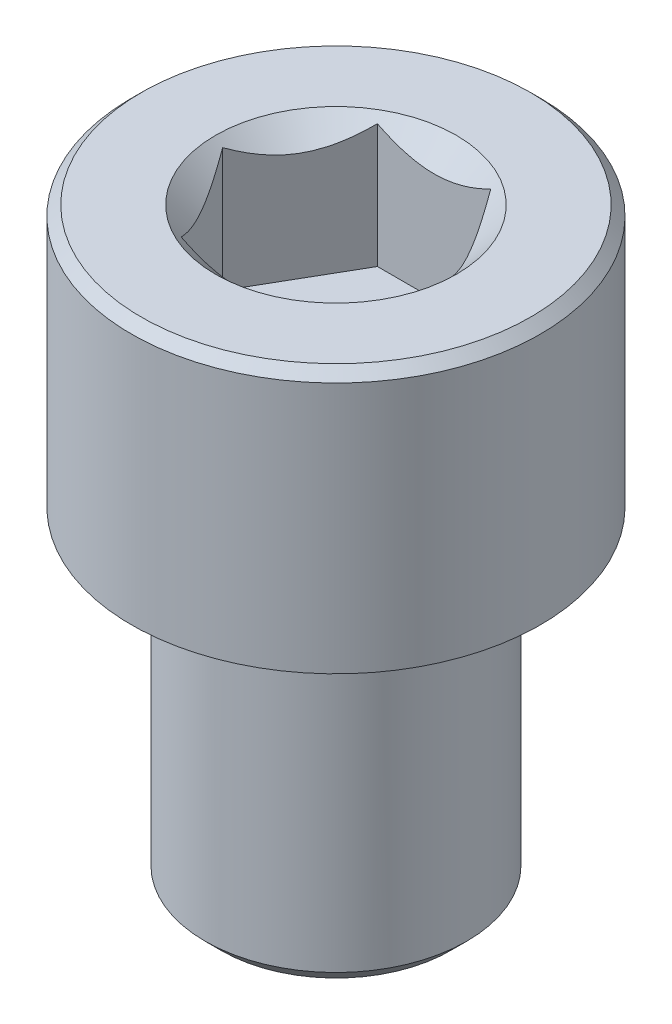
ISO-10303-21;
HEADER;
FILE_DESCRIPTION(('STEP AP214'),'2;1');
FILE_NAME('part.step','',(''),(''),'','','');
FILE_SCHEMA(('AUTOMOTIVE_DESIGN { 1 0 10303 214 1 1 1 1 }'));
ENDSEC;
DATA;
#1=APPLICATION_CONTEXT('core data for automotive mechanical design processes');
#2=APPLICATION_PROTOCOL_DEFINITION('international standard','automotive_design',2000,#1);
#3=PRODUCT_CONTEXT('',#1,'mechanical');
#4=PRODUCT('Part','Part','',(#3));
#5=PRODUCT_RELATED_PRODUCT_CATEGORY('part','',(#4));
#6=PRODUCT_DEFINITION_FORMATION('','',#4);
#7=PRODUCT_DEFINITION_CONTEXT('part definition',#1,'design');
#8=PRODUCT_DEFINITION('design','',#6,#7);
#9=PRODUCT_DEFINITION_SHAPE('','',#8);
#10=(LENGTH_UNIT() NAMED_UNIT(*) SI_UNIT(.MILLI.,.METRE.));
#11=(NAMED_UNIT(*) PLANE_ANGLE_UNIT() SI_UNIT($,.RADIAN.));
#12=(NAMED_UNIT(*) SI_UNIT($,.STERADIAN.) SOLID_ANGLE_UNIT());
#13=UNCERTAINTY_MEASURE_WITH_UNIT(LENGTH_MEASURE(1.E-05),#10,'distance_accuracy_value','');
#14=(GEOMETRIC_REPRESENTATION_CONTEXT(3) GLOBAL_UNCERTAINTY_ASSIGNED_CONTEXT((#13)) GLOBAL_UNIT_ASSIGNED_CONTEXT((#10,
#11,#12)) REPRESENTATION_CONTEXT('',''));
#15=CARTESIAN_POINT('',(0.,0.,0.));
#16=DIRECTION('',(0.,0.,1.));
#17=DIRECTION('',(1.,0.,0.));
#18=AXIS2_PLACEMENT_3D('',#15,#16,#17);
#19=CARTESIAN_POINT('',(0.,0.,0.));
#20=DIRECTION('',(0.,1.,0.));
#21=DIRECTION('',(0.,0.,1.));
#22=AXIS2_PLACEMENT_3D('',#19,#20,#21);
#23=PLANE('',#22);
#24=CARTESIAN_POINT('',(0.,0.,0.));
#25=DIRECTION('',(0.,1.,0.));
#26=DIRECTION('',(0.,0.,1.));
#27=AXIS2_PLACEMENT_3D('',#24,#25,#26);
#28=CIRCLE('',#27,3.5);
#29=CARTESIAN_POINT('',(0.,0.,3.5));
#30=VERTEX_POINT('',#29);
#31=EDGE_CURVE('E42',#30,#30,#28,.F.);
#32=ORIENTED_EDGE('',*,*,#31,.T.);
#33=EDGE_LOOP('',(#32));
#34=FACE_BOUND('',#33,.T.);
#35=ADVANCED_FACE('F34',(#34),#23,.F.);
#36=CARTESIAN_POINT('',(0.,0.,0.));
#37=DIRECTION('',(0.,-1.,0.));
#38=DIRECTION('',(0.,0.,-1.));
#39=AXIS2_PLACEMENT_3D('',#36,#37,#38);
#40=CYLINDRICAL_SURFACE('',#39,4.);
#41=CARTESIAN_POINT('',(0.,0.500000000000004,0.));
#42=DIRECTION('',(0.,1.,0.));
#43=DIRECTION('',(0.,0.,1.));
#44=AXIS2_PLACEMENT_3D('',#41,#42,#43);
#45=CIRCLE('',#44,4.);
#46=CARTESIAN_POINT('',(0.,0.500000000000004,4.));
#47=VERTEX_POINT('',#46);
#48=EDGE_CURVE('E11',#47,#47,#45,.T.);
#49=ORIENTED_EDGE('',*,*,#48,.T.);
#50=EDGE_LOOP('',(#49));
#51=FACE_BOUND('',#50,.T.);
#52=CARTESIAN_POINT('',(0.,10.,0.));
#53=DIRECTION('',(0.,-1.,0.));
#54=DIRECTION('',(0.,0.,-1.));
#55=AXIS2_PLACEMENT_3D('',#52,#53,#54);
#56=CIRCLE('',#55,4.);
#57=CARTESIAN_POINT('',(0.,10.,-4.));
#58=VERTEX_POINT('',#57);
#59=EDGE_CURVE('E119',#58,#58,#56,.T.);
#60=ORIENTED_EDGE('',*,*,#59,.T.);
#61=EDGE_LOOP('',(#60));
#62=FACE_BOUND('',#61,.T.);
#63=ADVANCED_FACE('F190',(#51,#62),#40,.T.);
#64=CARTESIAN_POINT('',(-4.,10.,0.));
#65=DIRECTION('',(0.,1.,0.));
#66=DIRECTION('',(0.,0.,1.));
#67=AXIS2_PLACEMENT_3D('',#64,#65,#66);
#68=PLANE('',#67);
#69=ORIENTED_EDGE('',*,*,#59,.F.);
#70=EDGE_LOOP('',(#69));
#71=FACE_BOUND('',#70,.T.);
#72=CARTESIAN_POINT('',(0.,10.,0.));
#73=DIRECTION('',(0.,-1.,0.));
#74=DIRECTION('',(0.,0.,-1.));
#75=AXIS2_PLACEMENT_3D('',#72,#73,#74);
#76=CIRCLE('',#75,6.25);
#77=CARTESIAN_POINT('',(0.,10.,-6.25));
#78=VERTEX_POINT('',#77);
#79=EDGE_CURVE('E116',#78,#78,#76,.T.);
#80=ORIENTED_EDGE('',*,*,#79,.T.);
#81=EDGE_LOOP('',(#80));
#82=FACE_BOUND('',#81,.T.);
#83=ADVANCED_FACE('F196',(#71,#82),#68,.F.);
#84=CARTESIAN_POINT('',(0.,0.,0.));
#85=DIRECTION('',(0.,-1.,0.));
#86=DIRECTION('',(0.,0.,-1.));
#87=AXIS2_PLACEMENT_3D('',#84,#85,#86);
#88=CYLINDRICAL_SURFACE('',#87,6.25);
#89=CARTESIAN_POINT('',(0.,17.7,0.));
#90=DIRECTION('',(0.,-1.,0.));
#91=DIRECTION('',(0.,0.,-1.));
#92=AXIS2_PLACEMENT_3D('',#89,#90,#91);
#93=CIRCLE('',#92,6.25);
#94=CARTESIAN_POINT('',(0.,17.7,-6.25));
#95=VERTEX_POINT('',#94);
#96=EDGE_CURVE('E122',#95,#95,#93,.T.);
#97=ORIENTED_EDGE('',*,*,#96,.T.);
#98=EDGE_LOOP('',(#97));
#99=FACE_BOUND('',#98,.T.);
#100=ORIENTED_EDGE('',*,*,#79,.F.);
#101=EDGE_LOOP('',(#100));
#102=FACE_BOUND('',#101,.T.);
#103=ADVANCED_FACE('F207',(#99,#102),#88,.T.);
#104=CARTESIAN_POINT('',(-6.25,18.,0.));
#105=DIRECTION('',(0.,-1.,0.));
#106=DIRECTION('',(0.,0.,-1.));
#107=AXIS2_PLACEMENT_3D('',#104,#105,#106);
#108=PLANE('',#107);
#109=CARTESIAN_POINT('',(0.,18.,0.));
#110=DIRECTION('',(0.,1.,0.));
#111=DIRECTION('',(0.,0.,1.));
#112=AXIS2_PLACEMENT_3D('',#109,#110,#111);
#113=CIRCLE('',#112,3.68172134015619);
#114=CARTESIAN_POINT('',(0.,18.,3.68172134015619));
#115=VERTEX_POINT('',#114);
#116=EDGE_CURVE('E337',#115,#115,#113,.T.);
#117=ORIENTED_EDGE('',*,*,#116,.F.);
#118=EDGE_LOOP('',(#117));
#119=FACE_BOUND('',#118,.T.);
#120=CARTESIAN_POINT('',(0.,18.,0.));
#121=DIRECTION('',(0.,-1.,0.));
#122=DIRECTION('',(0.,0.,-1.));
#123=AXIS2_PLACEMENT_3D('',#120,#121,#122);
#124=CIRCLE('',#123,5.95);
#125=CARTESIAN_POINT('',(0.,18.,-5.95));
#126=VERTEX_POINT('',#125);
#127=EDGE_CURVE('E93',#126,#126,#124,.F.);
#128=ORIENTED_EDGE('',*,*,#127,.T.);
#129=EDGE_LOOP('',(#128));
#130=FACE_BOUND('',#129,.T.);
#131=ADVANCED_FACE('F202',(#119,#130),#108,.F.);
#132=CARTESIAN_POINT('',(0.,17.7,0.));
#133=DIRECTION('',(0.,-1.,0.));
#134=DIRECTION('',(0.,0.,-1.));
#135=AXIS2_PLACEMENT_3D('',#132,#133,#134);
#136=CONICAL_SURFACE('',#135,6.25,0.785398163397451);
#137=ORIENTED_EDGE('',*,*,#127,.F.);
#138=EDGE_LOOP('',(#137));
#139=FACE_BOUND('',#138,.T.);
#140=ORIENTED_EDGE('',*,*,#96,.F.);
#141=EDGE_LOOP('',(#140));
#142=FACE_BOUND('',#141,.T.);
#143=ADVANCED_FACE('F138',(#139,#142),#136,.T.);
#144=CARTESIAN_POINT('',(0.,18.,0.));
#145=DIRECTION('',(0.,1.,0.));
#146=DIRECTION('',(0.,0.,1.));
#147=AXIS2_PLACEMENT_3D('',#144,#145,#146);
#148=CONICAL_SURFACE('',#147,3.68172134015619,0.785398163397449);
#149=ORIENTED_EDGE('',*,*,#116,.T.);
#150=EDGE_LOOP('',(#149));
#151=FACE_BOUND('',#150,.T.);
#152=CARTESIAN_POINT('',(-3.57414153717217,18.9845928078346,3.));
#153=CARTESIAN_POINT('',(-3.48763354421076,18.918347344031,3.));
#154=CARTESIAN_POINT('',(-3.4006548570127,18.8527068014046,3.));
#155=CARTESIAN_POINT('',(-3.22556536628367,18.7229105596247,3.));
#156=CARTESIAN_POINT('',(-3.13745429592207,18.6587552207989,3.));
#157=CARTESIAN_POINT('',(-2.95926502940819,18.5317477625692,3.));
#158=CARTESIAN_POINT('',(-2.86917689491203,18.4689095404859,3.));
#159=CARTESIAN_POINT('',(-2.68749351951163,18.3454583721269,3.));
#160=CARTESIAN_POINT('',(-2.5958983836401,18.2848452717117,3.));
#161=CARTESIAN_POINT('',(-2.40523426187287,18.1626856152111,3.));
#162=CARTESIAN_POINT('',(-2.30605328102178,18.1013129786067,3.));
#163=CARTESIAN_POINT('',(-2.10536506104801,17.9824325210317,3.));
#164=CARTESIAN_POINT('',(-2.00385743987678,17.9249253409785,3.));
#165=CARTESIAN_POINT('',(-1.79849745550954,17.8150046063731,3.));
#166=CARTESIAN_POINT('',(-1.69465316441121,17.7625760890662,3.));
#167=CARTESIAN_POINT('',(-1.48405420683511,17.663987161909,3.));
#168=CARTESIAN_POINT('',(-1.37730092797841,17.6178238242345,3.));
#169=CARTESIAN_POINT('',(-1.17088222190216,17.5374103113695,3.));
#170=CARTESIAN_POINT('',(-1.07149734601239,17.5024473221765,3.));
#171=CARTESIAN_POINT('',(-0.870230144552072,17.4404802404136,3.));
#172=CARTESIAN_POINT('',(-0.768347657354243,17.4134766643998,3.));
#173=CARTESIAN_POINT('',(-0.564447624779059,17.3693266023403,3.));
#174=CARTESIAN_POINT('',(-0.462468933304162,17.3520036676269,3.));
#175=CARTESIAN_POINT('',(-0.257288650084502,17.3275703633682,3.));
#176=CARTESIAN_POINT('',(-0.154087304614487,17.3204579712627,3.));
#177=CARTESIAN_POINT('',(0.0481861337271417,17.3170323431805,3.));
#178=CARTESIAN_POINT('',(0.147250905244535,17.3202810238262,3.));
#179=CARTESIAN_POINT('',(0.344589076655322,17.3364014246806,3.));
#180=CARTESIAN_POINT('',(0.442862402476966,17.3492740352571,3.));
#181=CARTESIAN_POINT('',(0.639570667541513,17.3841396910622,3.));
#182=CARTESIAN_POINT('',(0.737976852204938,17.4062922789742,3.));
#183=CARTESIAN_POINT('',(0.932628435913933,17.4585009084323,3.));
#184=CARTESIAN_POINT('',(1.02887397223985,17.4885564463,3.));
#185=CARTESIAN_POINT('',(1.22532003458176,17.5574747225556,3.));
#186=CARTESIAN_POINT('',(1.32536043310458,17.5967888675383,3.));
#187=CARTESIAN_POINT('',(1.5228495241282,17.6814775662887,3.));
#188=CARTESIAN_POINT('',(1.62029736425405,17.7268540844093,3.));
#189=CARTESIAN_POINT('',(1.8130860429893,17.8225985437204,3.));
#190=CARTESIAN_POINT('',(1.90841896877327,17.8729822890255,3.));
#191=CARTESIAN_POINT('',(2.09689622819786,17.9776272778976,3.));
#192=CARTESIAN_POINT('',(2.19004094502824,18.031887835746,3.));
#193=CARTESIAN_POINT('',(2.36987261179099,18.1407691556288,3.));
#194=CARTESIAN_POINT('',(2.45665114613525,18.1952394529636,3.));
#195=CARTESIAN_POINT('',(2.62871750489488,18.3064926464856,3.));
#196=CARTESIAN_POINT('',(2.71400521657293,18.3632757164947,3.));
#197=CARTESIAN_POINT('',(2.88259790064295,18.4782780272199,3.));
#198=CARTESIAN_POINT('',(2.96591330750259,18.5364820260229,3.));
#199=CARTESIAN_POINT('',(3.13140205426232,18.6544457904063,3.));
#200=CARTESIAN_POINT('',(3.21357570254096,18.7142051228644,3.));
#201=CARTESIAN_POINT('',(3.29527058173679,18.7746009335197,3.));
#202=B_SPLINE_CURVE_WITH_KNOTS('',3,(#152,#153,#154,#155,#156,#157,#158,#159,#160,#161,#162,
#163,#164,#165,#166,#167,#168,#169,#170,#171,#172,#173,#174,#175,#176,#177,#178,#179,#180,#181,
#182,#183,#184,#185,#186,#187,#188,#189,#190,#191,#192,#193,#194,#195,#196,#197,#198,#199,#200,
#201),.UNSPECIFIED.,.F.,.F.,(4,2,2,2,2,2,2,2,2,2,2,2,2,2,2,2,2,2,2,2,2,2,2,2,4),(0.,
0.326883534696339,0.653845561216814,0.98333357467949,1.31279872045119,1.66263039077581,
2.01251992306798,2.36134508374107,2.71000666706381,3.02579926641578,3.34161235580211,
3.65146388205707,3.96125402275306,4.25812208285704,4.555017611415,4.85724167639795,
5.15944648441815,5.48166266665301,5.80398350895795,6.12735610013866,6.45067163510514,
6.75800096012908,7.06535342598929,7.37023156667127,7.67502569596998),.UNSPECIFIED.);
#203=CARTESIAN_POINT('',(-1.73205080756888,17.7823802749816,3.));
#204=VERTEX_POINT('',#203);
#205=CARTESIAN_POINT('',(1.73205080756888,17.7823802749816,3.));
#206=VERTEX_POINT('',#205);
#207=EDGE_CURVE('E100',#204,#206,#202,.T.);
#208=ORIENTED_EDGE('',*,*,#207,.F.);
#209=CARTESIAN_POINT('',(-3.46421708519159,17.7824957508087,-0.00020000000000073));
#210=CARTESIAN_POINT('',(-3.40467869607211,17.7230085933034,0.102923514955748));
#211=CARTESIAN_POINT('',(-3.3441447475778,17.6670152544471,0.20777138933065));
#212=CARTESIAN_POINT('',(-3.2207094063533,17.5644928713605,0.421567671781096));
#213=CARTESIAN_POINT('',(-3.15779627521275,17.5180208687229,0.530536411379759));
#214=CARTESIAN_POINT('',(-3.03093496880242,17.4384134634979,0.750266639597027));
#215=CARTESIAN_POINT('',(-2.96701910000607,17.4050779756242,0.86097217176221));
#216=CARTESIAN_POINT('',(-2.83778025907547,17.3537178189609,1.08482041056532));
#217=CARTESIAN_POINT('',(-2.7724612348602,17.3356548125172,1.19795627920699));
#218=CARTESIAN_POINT('',(-2.65988677911464,17.3193571834321,1.3929409561927));
#219=CARTESIAN_POINT('',(-2.6127767304643,17.3169446421554,1.47453795400213));
#220=CARTESIAN_POINT('',(-2.51863325954798,17.3210097096387,1.63759922883009));
#221=CARTESIAN_POINT('',(-2.47159986993094,17.3274904350099,1.71906344929899));
#222=CARTESIAN_POINT('',(-2.37797867687426,17.3489719974968,1.88122011233837));
#223=CARTESIAN_POINT('',(-2.33139143122689,17.3639823649488,1.9619115887843));
#224=CARTESIAN_POINT('',(-2.23901705721439,17.4017039210476,2.12190869789133));
#225=CARTESIAN_POINT('',(-2.19322986779049,17.4244145193044,2.20121443630929));
#226=CARTESIAN_POINT('',(-2.11194373930153,17.4711409598355,2.34200614080275));
#227=CARTESIAN_POINT('',(-2.07626488907772,17.4939286026624,2.40380372214602));
#228=CARTESIAN_POINT('',(-2.00554773988155,17.543176561039,2.52628941752022));
#229=CARTESIAN_POINT('',(-1.97050946049034,17.5696369886478,2.5869774976356));
#230=CARTESIAN_POINT('',(-1.90118383838356,17.6256372693729,2.70705299739086));
#231=CARTESIAN_POINT('',(-1.86689452386373,17.6551674394599,2.76644383229592));
#232=CARTESIAN_POINT('',(-1.79895094584795,17.7169193665571,2.88412556146727));
#233=CARTESIAN_POINT('',(-1.76529630793217,17.7491394716409,2.94241710424774));
#234=CARTESIAN_POINT('',(-1.73193533751504,17.7824957508087,3.0002));
#235=B_SPLINE_CURVE_WITH_KNOTS('',3,(#209,#210,#211,#212,#213,#214,#215,#216,#217,#218,#219,
#220,#221,#222,#223,#224,#225,#226,#227,#228,#229,#230,#231,#232,#233,#234),.UNSPECIFIED.,.F.,
.F.,(4,2,2,2,2,2,2,2,2,2,2,2,4),(0.,0.399603557139307,0.801535286397844,1.19708369162343,
1.59163620080173,1.87398941755844,2.15644160919093,2.43921001247425,2.72195674032138,
2.94657516661926,3.17120044767274,3.3951375283781,3.61893808380739),.UNSPECIFIED.);
#236=CARTESIAN_POINT('',(-3.46410161513776,17.7823802749816,0.));
#237=VERTEX_POINT('',#236);
#238=EDGE_CURVE('E158',#237,#204,#235,.T.);
#239=ORIENTED_EDGE('',*,*,#238,.F.);
#240=CARTESIAN_POINT('',(-1.73193533751504,17.7824957508087,-3.0002));
#241=CARTESIAN_POINT('',(-1.79147372663452,17.7230085933034,-2.89707648504425));
#242=CARTESIAN_POINT('',(-1.85200767512883,17.6670152544471,-2.79222861066935));
#243=CARTESIAN_POINT('',(-1.97544301635334,17.5644928713605,-2.5784323282189));
#244=CARTESIAN_POINT('',(-2.03835614749388,17.5180208687229,-2.46946358862024));
#245=CARTESIAN_POINT('',(-2.16521745390422,17.4384134634979,-2.24973336040297));
#246=CARTESIAN_POINT('',(-2.22913332270057,17.4050779756242,-2.13902782823779));
#247=CARTESIAN_POINT('',(-2.35837216363117,17.3537178189609,-1.91517958943468));
#248=CARTESIAN_POINT('',(-2.42369118784644,17.3356548125172,-1.80204372079301));
#249=CARTESIAN_POINT('',(-2.53626564359199,17.3193571834321,-1.6070590438073));
#250=CARTESIAN_POINT('',(-2.58337569224233,17.3169446421554,-1.52546204599787));
#251=CARTESIAN_POINT('',(-2.67751916315865,17.3210097096387,-1.36240077116991));
#252=CARTESIAN_POINT('',(-2.72455255277569,17.3274904350099,-1.28093655070101));
#253=CARTESIAN_POINT('',(-2.81817374583237,17.3489719974968,-1.11877988766163));
#254=CARTESIAN_POINT('',(-2.86476099147974,17.3639823649488,-1.0380884112157));
#255=CARTESIAN_POINT('',(-2.95713536549225,17.4017039210476,-0.878091302108669));
#256=CARTESIAN_POINT('',(-3.00292255491614,17.4244145193044,-0.798785563690708));
#257=CARTESIAN_POINT('',(-3.0842086834051,17.4711409598355,-0.657993859197251));
#258=CARTESIAN_POINT('',(-3.11988753362891,17.4939286026624,-0.596196277853979));
#259=CARTESIAN_POINT('',(-3.19060468282508,17.543176561039,-0.473710582479785));
#260=CARTESIAN_POINT('',(-3.2256429622163,17.5696369886478,-0.4130225023644));
#261=CARTESIAN_POINT('',(-3.29496858432308,17.6256372693729,-0.292947002609139));
#262=CARTESIAN_POINT('',(-3.32925789884291,17.6551674394599,-0.233556167704084));
#263=CARTESIAN_POINT('',(-3.39720147685869,17.7169193665571,-0.115874438532732));
#264=CARTESIAN_POINT('',(-3.43085611477447,17.7491394716409,-0.0575828957522664));
#265=CARTESIAN_POINT('',(-3.46421708519159,17.7824957508087,0.000199999999999382));
#266=B_SPLINE_CURVE_WITH_KNOTS('',3,(#240,#241,#242,#243,#244,#245,#246,#247,#248,#249,#250,
#251,#252,#253,#254,#255,#256,#257,#258,#259,#260,#261,#262,#263,#264,#265),.UNSPECIFIED.,.F.,
.F.,(4,2,2,2,2,2,2,2,2,2,2,2,4),(0.,0.399603557139306,0.801535286397843,1.19708369162342,
1.59163620080172,1.87398941755844,2.15644160919092,2.43921001247424,2.72195674032137,
2.94657516661926,3.17120044767274,3.3951375283781,3.61893808380739),.UNSPECIFIED.);
#267=CARTESIAN_POINT('',(-1.73205080756888,17.7823802749816,-3.));
#268=VERTEX_POINT('',#267);
#269=EDGE_CURVE('E152',#268,#237,#266,.T.);
#270=ORIENTED_EDGE('',*,*,#269,.F.);
#271=CARTESIAN_POINT('',(-3.57414153716177,18.9845928078267,-3.));
#272=CARTESIAN_POINT('',(-3.48763354420067,18.9183473440233,-3.));
#273=CARTESIAN_POINT('',(-3.40065485700291,18.8527068013973,-3.));
#274=CARTESIAN_POINT('',(-3.22556536627447,18.722910559618,-3.));
#275=CARTESIAN_POINT('',(-3.13745429591317,18.6587552207925,-3.));
#276=CARTESIAN_POINT('',(-2.95926502939991,18.5317477625634,-3.));
#277=CARTESIAN_POINT('',(-2.86917689490407,18.4689095404804,-3.));
#278=CARTESIAN_POINT('',(-2.68749351950429,18.345458372122,-3.));
#279=CARTESIAN_POINT('',(-2.59589838363308,18.2848452717071,-3.));
#280=CARTESIAN_POINT('',(-2.40523426186654,18.1626856152071,-3.));
#281=CARTESIAN_POINT('',(-2.30605328101581,18.1013129786031,-3.));
#282=CARTESIAN_POINT('',(-2.10536506104279,17.9824325210287,-3.));
#283=CARTESIAN_POINT('',(-2.00385743987194,17.9249253409758,-3.));
#284=CARTESIAN_POINT('',(-1.79849745550548,17.815004606371,-3.));
#285=CARTESIAN_POINT('',(-1.69465316440755,17.7625760890644,-3.));
#286=CARTESIAN_POINT('',(-1.48405420683226,17.6639871619078,-3.));
#287=CARTESIAN_POINT('',(-1.37730092797597,17.6178238242335,-3.));
#288=CARTESIAN_POINT('',(-1.1708822218999,17.5374103113687,-3.));
#289=CARTESIAN_POINT('',(-1.07149734600987,17.5024473221756,-3.));
#290=CARTESIAN_POINT('',(-0.870230144549026,17.4404802404128,-3.));
#291=CARTESIAN_POINT('',(-0.768347657350928,17.413476664399,-3.));
#292=CARTESIAN_POINT('',(-0.564447624775213,17.3693266023395,-3.));
#293=CARTESIAN_POINT('',(-0.462468933300056,17.3520036676262,-3.));
#294=CARTESIAN_POINT('',(-0.257288650079881,17.3275703633678,-3.));
#295=CARTESIAN_POINT('',(-0.154087304609613,17.3204579712624,-3.));
#296=CARTESIAN_POINT('',(0.0481861337324568,17.3170323431805,-3.));
#297=CARTESIAN_POINT('',(0.147250905250039,17.3202810238264,-3.));
#298=CARTESIAN_POINT('',(0.344589076661181,17.3364014246813,-3.));
#299=CARTESIAN_POINT('',(0.442862402482991,17.349274035258,-3.));
#300=CARTESIAN_POINT('',(0.639570667547869,17.3841396910636,-3.));
#301=CARTESIAN_POINT('',(0.737976852211456,17.4062922789758,-3.));
#302=CARTESIAN_POINT('',(0.93262843592076,17.4585009084343,-3.));
#303=CARTESIAN_POINT('',(1.02887397224682,17.4885564463023,-3.));
#304=CARTESIAN_POINT('',(1.22532003458955,17.5574747225585,-3.));
#305=CARTESIAN_POINT('',(1.32536043311302,17.5967888675417,-3.));
#306=CARTESIAN_POINT('',(1.52284952413792,17.6814775662931,-3.));
#307=CARTESIAN_POINT('',(1.62029736426439,17.7268540844142,-3.));
#308=CARTESIAN_POINT('',(1.81308604300087,17.8225985437264,-3.));
#309=CARTESIAN_POINT('',(1.90841896878543,17.8729822890321,-3.));
#310=CARTESIAN_POINT('',(2.0968962282112,17.9776272779052,-3.));
#311=CARTESIAN_POINT('',(2.19004094504216,18.0318878357542,-3.));
#312=CARTESIAN_POINT('',(2.36987261180596,18.1407691556381,-3.));
#313=CARTESIAN_POINT('',(2.4566511461507,18.1952394529734,-3.));
#314=CARTESIAN_POINT('',(2.62871750491126,18.3064926464964,-3.));
#315=CARTESIAN_POINT('',(2.71400521658979,18.363275716506,-3.));
#316=CARTESIAN_POINT('',(2.88259790066073,18.4782780272322,-3.));
#317=CARTESIAN_POINT('',(2.96591330752082,18.5364820260357,-3.));
#318=CARTESIAN_POINT('',(3.13140205428147,18.6544457904201,-3.));
#319=CARTESIAN_POINT('',(3.21357570256056,18.7142051228787,-3.));
#320=CARTESIAN_POINT('',(3.29527058175684,18.7746009335345,-3.));
#321=B_SPLINE_CURVE_WITH_KNOTS('',3,(#271,#272,#273,#274,#275,#276,#277,#278,#279,#280,#281,
#282,#283,#284,#285,#286,#287,#288,#289,#290,#291,#292,#293,#294,#295,#296,#297,#298,#299,#300,
#301,#302,#303,#304,#305,#306,#307,#308,#309,#310,#311,#312,#313,#314,#315,#316,#317,#318,#319,
#320),.UNSPECIFIED.,.F.,.F.,(4,2,2,2,2,2,2,2,2,2,2,2,2,2,2,2,2,2,2,2,2,2,2,2,4),(0.,
0.32688353469507,0.653845561214273,0.983333574675647,1.31279872044605,1.66263039076922,
2.01251992305992,2.36134508373157,2.71000666705287,3.0257992664056,3.34161235579269,
3.65146388204837,3.96125402274508,4.25812208284964,4.55501761140818,4.85724167639176,
5.15944648441259,5.4816626666498,5.80398350895708,6.12735610014015,6.45067163510898,
6.75800096013494,7.06535342599716,7.37023156668112,7.67502569598182),.UNSPECIFIED.);
#322=CARTESIAN_POINT('',(1.73205080756888,17.7823802749816,-3.));
#323=VERTEX_POINT('',#322);
#324=EDGE_CURVE('E49',#323,#268,#321,.F.);
#325=ORIENTED_EDGE('',*,*,#324,.F.);
#326=CARTESIAN_POINT('',(3.46421708519159,17.7824957508087,0.000199999999999057));
#327=CARTESIAN_POINT('',(3.40467869607211,17.7230085933034,-0.102923514955749));
#328=CARTESIAN_POINT('',(3.3441447475778,17.6670152544471,-0.207771389330651));
#329=CARTESIAN_POINT('',(3.22070940635329,17.5644928713605,-0.421567671781098));
#330=CARTESIAN_POINT('',(3.15779627521275,17.5180208687229,-0.530536411379763));
#331=CARTESIAN_POINT('',(3.03093496880241,17.4384134634979,-0.750266639597032));
#332=CARTESIAN_POINT('',(2.96701910000606,17.4050779756242,-0.860972171762215));
#333=CARTESIAN_POINT('',(2.83778025907546,17.3537178189609,-1.08482041056533));
#334=CARTESIAN_POINT('',(2.77246123486019,17.3356548125172,-1.197956279207));
#335=CARTESIAN_POINT('',(2.65988677911464,17.3193571834321,-1.3929409561927));
#336=CARTESIAN_POINT('',(2.6127767304643,17.3169446421554,-1.47453795400214));
#337=CARTESIAN_POINT('',(2.51863325954798,17.3210097096387,-1.63759922883009));
#338=CARTESIAN_POINT('',(2.47159986993094,17.3274904350099,-1.71906344929899));
#339=CARTESIAN_POINT('',(2.37797867687426,17.3489719974968,-1.88122011233837));
#340=CARTESIAN_POINT('',(2.33139143122689,17.3639823649488,-1.9619115887843));
#341=CARTESIAN_POINT('',(2.23901705721438,17.4017039210476,-2.12190869789134));
#342=CARTESIAN_POINT('',(2.19322986779049,17.4244145193044,-2.2012144363093));
#343=CARTESIAN_POINT('',(2.11194373930153,17.4711409598355,-2.34200614080275));
#344=CARTESIAN_POINT('',(2.07626488907772,17.4939286026624,-2.40380372214603));
#345=CARTESIAN_POINT('',(2.00554773988155,17.543176561039,-2.52628941752022));
#346=CARTESIAN_POINT('',(1.97050946049033,17.5696369886478,-2.5869774976356));
#347=CARTESIAN_POINT('',(1.90118383838356,17.6256372693729,-2.70705299739086));
#348=CARTESIAN_POINT('',(1.86689452386373,17.6551674394599,-2.76644383229592));
#349=CARTESIAN_POINT('',(1.79895094584795,17.7169193665571,-2.88412556146727));
#350=CARTESIAN_POINT('',(1.76529630793217,17.7491394716409,-2.94241710424773));
#351=CARTESIAN_POINT('',(1.73193533751504,17.7824957508087,-3.0002));
#352=B_SPLINE_CURVE_WITH_KNOTS('',3,(#326,#327,#328,#329,#330,#331,#332,#333,#334,#335,#336,
#337,#338,#339,#340,#341,#342,#343,#344,#345,#346,#347,#348,#349,#350,#351),.UNSPECIFIED.,.F.,
.F.,(4,2,2,2,2,2,2,2,2,2,2,2,4),(0.,0.399603557139308,0.801535286397849,1.19708369162343,
1.59163620080173,1.87398941755844,2.15644160919093,2.43921001247425,2.72195674032138,
2.94657516661927,3.17120044767274,3.3951375283781,3.61893808380739),.UNSPECIFIED.);
#353=CARTESIAN_POINT('',(3.46410161513775,17.7823802749816,0.));
#354=VERTEX_POINT('',#353);
#355=EDGE_CURVE('E86',#354,#323,#352,.T.);
#356=ORIENTED_EDGE('',*,*,#355,.F.);
#357=CARTESIAN_POINT('',(1.73193533751504,17.7824957508087,3.0002));
#358=CARTESIAN_POINT('',(1.79147372663452,17.7230085933034,2.89707648504425));
#359=CARTESIAN_POINT('',(1.85200767512883,17.6670152544471,2.79222861066935));
#360=CARTESIAN_POINT('',(1.97544301635334,17.5644928713605,2.5784323282189));
#361=CARTESIAN_POINT('',(2.03835614749388,17.5180208687229,2.46946358862024));
#362=CARTESIAN_POINT('',(2.16521745390422,17.4384134634979,2.24973336040297));
#363=CARTESIAN_POINT('',(2.22913332270057,17.4050779756242,2.13902782823779));
#364=CARTESIAN_POINT('',(2.35837216363117,17.3537178189609,1.91517958943468));
#365=CARTESIAN_POINT('',(2.42369118784644,17.3356548125172,1.80204372079301));
#366=CARTESIAN_POINT('',(2.53626564359199,17.3193571834321,1.6070590438073));
#367=CARTESIAN_POINT('',(2.58337569224233,17.3169446421554,1.52546204599787));
#368=CARTESIAN_POINT('',(2.67751916315865,17.3210097096387,1.36240077116991));
#369=CARTESIAN_POINT('',(2.72455255277569,17.3274904350099,1.28093655070101));
#370=CARTESIAN_POINT('',(2.81817374583237,17.3489719974968,1.11877988766163));
#371=CARTESIAN_POINT('',(2.86476099147974,17.3639823649488,1.0380884112157));
#372=CARTESIAN_POINT('',(2.95713536549225,17.4017039210476,0.878091302108667));
#373=CARTESIAN_POINT('',(3.00292255491614,17.4244145193044,0.798785563690706));
#374=CARTESIAN_POINT('',(3.0842086834051,17.4711409598355,0.65799385919725));
#375=CARTESIAN_POINT('',(3.11988753362891,17.4939286026624,0.596196277853977));
#376=CARTESIAN_POINT('',(3.19060468282508,17.543176561039,0.473710582479783));
#377=CARTESIAN_POINT('',(3.2256429622163,17.5696369886478,0.413022502364399));
#378=CARTESIAN_POINT('',(3.29496858432307,17.6256372693729,0.292947002609139));
#379=CARTESIAN_POINT('',(3.3292578988429,17.6551674394599,0.233556167704084));
#380=CARTESIAN_POINT('',(3.39720147685868,17.7169193665571,0.115874438532733));
#381=CARTESIAN_POINT('',(3.43085611477446,17.7491394716409,0.0575828957522668));
#382=CARTESIAN_POINT('',(3.46421708519159,17.7824957508087,-0.000199999999999721));
#383=B_SPLINE_CURVE_WITH_KNOTS('',3,(#357,#358,#359,#360,#361,#362,#363,#364,#365,#366,#367,
#368,#369,#370,#371,#372,#373,#374,#375,#376,#377,#378,#379,#380,#381,#382),.UNSPECIFIED.,.F.,
.F.,(4,2,2,2,2,2,2,2,2,2,2,2,4),(0.,0.399603557139307,0.801535286397845,1.19708369162343,
1.59163620080173,1.87398941755844,2.15644160919092,2.43921001247425,2.72195674032138,
2.94657516661926,3.17120044767274,3.3951375283781,3.61893808380739),.UNSPECIFIED.);
#384=EDGE_CURVE('E89',#206,#354,#383,.T.);
#385=ORIENTED_EDGE('',*,*,#384,.F.);
#386=EDGE_LOOP('',(#208,#239,#270,#325,#356,#385));
#387=FACE_BOUND('',#386,.T.);
#388=ADVANCED_FACE('F88',(#151,#387),#148,.F.);
#389=CARTESIAN_POINT('',(3.46410161513775,14.,0.));
#390=DIRECTION('',(0.,1.,0.));
#391=DIRECTION('',(0.,0.,1.));
#392=AXIS2_PLACEMENT_3D('',#389,#390,#391);
#393=PLANE('',#392);
#394=DIRECTION('',(0.5,0.,-0.866025403784439));
#395=VECTOR('',#394,1.);
#396=CARTESIAN_POINT('',(1.73205080756888,14.,3.));
#397=LINE('',#396,#395);
#398=CARTESIAN_POINT('',(1.73205080756888,14.,3.));
#399=VERTEX_POINT('',#398);
#400=CARTESIAN_POINT('',(3.46410161513775,14.,0.));
#401=VERTEX_POINT('',#400);
#402=EDGE_CURVE('E99',#399,#401,#397,.T.);
#403=ORIENTED_EDGE('',*,*,#402,.T.);
#404=DIRECTION('',(-0.5,0.,-0.866025403784438));
#405=VECTOR('',#404,1.);
#406=CARTESIAN_POINT('',(3.46410161513775,14.,0.));
#407=LINE('',#406,#405);
#408=CARTESIAN_POINT('',(1.73205080756888,14.,-3.));
#409=VERTEX_POINT('',#408);
#410=EDGE_CURVE('E104',#401,#409,#407,.T.);
#411=ORIENTED_EDGE('',*,*,#410,.T.);
#412=DIRECTION('',(-1.,0.,0.));
#413=VECTOR('',#412,1.);
#414=CARTESIAN_POINT('',(1.73205080756888,14.,-3.));
#415=LINE('',#414,#413);
#416=CARTESIAN_POINT('',(-1.73205080756888,14.,-3.));
#417=VERTEX_POINT('',#416);
#418=EDGE_CURVE('E319',#409,#417,#415,.T.);
#419=ORIENTED_EDGE('',*,*,#418,.T.);
#420=DIRECTION('',(-0.5,0.,0.866025403784439));
#421=VECTOR('',#420,1.);
#422=CARTESIAN_POINT('',(-1.73205080756888,14.,-3.));
#423=LINE('',#422,#421);
#424=CARTESIAN_POINT('',(-3.46410161513776,14.,0.));
#425=VERTEX_POINT('',#424);
#426=EDGE_CURVE('E323',#417,#425,#423,.T.);
#427=ORIENTED_EDGE('',*,*,#426,.T.);
#428=DIRECTION('',(0.5,0.,0.866025403784439));
#429=VECTOR('',#428,1.);
#430=CARTESIAN_POINT('',(-3.46410161513776,14.,0.));
#431=LINE('',#430,#429);
#432=CARTESIAN_POINT('',(-1.73205080756888,14.,3.));
#433=VERTEX_POINT('',#432);
#434=EDGE_CURVE('E112',#425,#433,#431,.T.);
#435=ORIENTED_EDGE('',*,*,#434,.T.);
#436=DIRECTION('',(1.,0.,0.));
#437=VECTOR('',#436,1.);
#438=CARTESIAN_POINT('',(-1.73205080756888,14.,3.));
#439=LINE('',#438,#437);
#440=EDGE_CURVE('E107',#433,#399,#439,.T.);
#441=ORIENTED_EDGE('',*,*,#440,.T.);
#442=EDGE_LOOP('',(#403,#411,#419,#427,#435,#441));
#443=FACE_BOUND('',#442,.T.);
#444=ADVANCED_FACE('F137',(#443),#393,.T.);
#445=CARTESIAN_POINT('',(3.46410161513775,14.,0.));
#446=DIRECTION('',(0.866025403784439,0.,-0.5));
#447=DIRECTION('',(-0.5,0.,-0.866025403784438));
#448=AXIS2_PLACEMENT_3D('',#445,#446,#447);
#449=PLANE('',#448);
#450=DIRECTION('',(0.,1.,0.));
#451=VECTOR('',#450,1.);
#452=CARTESIAN_POINT('',(3.46410161513775,14.,0.));
#453=LINE('',#452,#451);
#454=EDGE_CURVE('E97',#401,#354,#453,.T.);
#455=ORIENTED_EDGE('',*,*,#454,.T.);
#456=ORIENTED_EDGE('',*,*,#355,.T.);
#457=DIRECTION('',(0.,1.,0.));
#458=VECTOR('',#457,1.);
#459=CARTESIAN_POINT('',(1.73205080756888,14.,-3.));
#460=LINE('',#459,#458);
#461=EDGE_CURVE('E106',#409,#323,#460,.T.);
#462=ORIENTED_EDGE('',*,*,#461,.F.);
#463=ORIENTED_EDGE('',*,*,#410,.F.);
#464=EDGE_LOOP('',(#455,#456,#462,#463));
#465=FACE_BOUND('',#464,.T.);
#466=ADVANCED_FACE('F102',(#465),#449,.F.);
#467=CARTESIAN_POINT('',(1.73205080756888,14.,-3.));
#468=DIRECTION('',(0.,0.,-1.));
#469=DIRECTION('',(-1.,0.,0.));
#470=AXIS2_PLACEMENT_3D('',#467,#468,#469);
#471=PLANE('',#470);
#472=ORIENTED_EDGE('',*,*,#461,.T.);
#473=ORIENTED_EDGE('',*,*,#324,.T.);
#474=DIRECTION('',(0.,1.,0.));
#475=VECTOR('',#474,1.);
#476=CARTESIAN_POINT('',(-1.73205080756888,14.,-3.));
#477=LINE('',#476,#475);
#478=EDGE_CURVE('E109',#417,#268,#477,.T.);
#479=ORIENTED_EDGE('',*,*,#478,.F.);
#480=ORIENTED_EDGE('',*,*,#418,.F.);
#481=EDGE_LOOP('',(#472,#473,#479,#480));
#482=FACE_BOUND('',#481,.T.);
#483=ADVANCED_FACE('F181',(#482),#471,.F.);
#484=CARTESIAN_POINT('',(-1.73205080756888,14.,-3.));
#485=DIRECTION('',(-0.866025403784439,0.,-0.5));
#486=DIRECTION('',(-0.5,0.,0.866025403784439));
#487=AXIS2_PLACEMENT_3D('',#484,#485,#486);
#488=PLANE('',#487);
#489=ORIENTED_EDGE('',*,*,#478,.T.);
#490=ORIENTED_EDGE('',*,*,#269,.T.);
#491=DIRECTION('',(0.,1.,0.));
#492=VECTOR('',#491,1.);
#493=CARTESIAN_POINT('',(-3.46410161513776,14.,0.));
#494=LINE('',#493,#492);
#495=EDGE_CURVE('E331',#425,#237,#494,.T.);
#496=ORIENTED_EDGE('',*,*,#495,.F.);
#497=ORIENTED_EDGE('',*,*,#426,.F.);
#498=EDGE_LOOP('',(#489,#490,#496,#497));
#499=FACE_BOUND('',#498,.T.);
#500=ADVANCED_FACE('F177',(#499),#488,.F.);
#501=CARTESIAN_POINT('',(-3.46410161513776,14.,0.));
#502=DIRECTION('',(-0.866025403784439,0.,0.5));
#503=DIRECTION('',(0.5,0.,0.866025403784439));
#504=AXIS2_PLACEMENT_3D('',#501,#502,#503);
#505=PLANE('',#504);
#506=ORIENTED_EDGE('',*,*,#495,.T.);
#507=ORIENTED_EDGE('',*,*,#238,.T.);
#508=DIRECTION('',(0.,1.,0.));
#509=VECTOR('',#508,1.);
#510=CARTESIAN_POINT('',(-1.73205080756888,14.,3.));
#511=LINE('',#510,#509);
#512=EDGE_CURVE('E328',#433,#204,#511,.T.);
#513=ORIENTED_EDGE('',*,*,#512,.F.);
#514=ORIENTED_EDGE('',*,*,#434,.F.);
#515=EDGE_LOOP('',(#506,#507,#513,#514));
#516=FACE_BOUND('',#515,.T.);
#517=ADVANCED_FACE('F174',(#516),#505,.F.);
#518=CARTESIAN_POINT('',(-1.73205080756888,14.,3.));
#519=DIRECTION('',(0.,0.,1.));
#520=DIRECTION('',(1.,0.,0.));
#521=AXIS2_PLACEMENT_3D('',#518,#519,#520);
#522=PLANE('',#521);
#523=ORIENTED_EDGE('',*,*,#512,.T.);
#524=ORIENTED_EDGE('',*,*,#207,.T.);
#525=DIRECTION('',(0.,1.,0.));
#526=VECTOR('',#525,1.);
#527=CARTESIAN_POINT('',(1.73205080756888,14.,3.));
#528=LINE('',#527,#526);
#529=EDGE_CURVE('E57',#399,#206,#528,.T.);
#530=ORIENTED_EDGE('',*,*,#529,.F.);
#531=ORIENTED_EDGE('',*,*,#440,.F.);
#532=EDGE_LOOP('',(#523,#524,#530,#531));
#533=FACE_BOUND('',#532,.T.);
#534=ADVANCED_FACE('F171',(#533),#522,.F.);
#535=CARTESIAN_POINT('',(1.73205080756888,14.,3.));
#536=DIRECTION('',(0.866025403784439,0.,0.5));
#537=DIRECTION('',(0.5,0.,-0.866025403784439));
#538=AXIS2_PLACEMENT_3D('',#535,#536,#537);
#539=PLANE('',#538);
#540=ORIENTED_EDGE('',*,*,#529,.T.);
#541=ORIENTED_EDGE('',*,*,#384,.T.);
#542=ORIENTED_EDGE('',*,*,#454,.F.);
#543=ORIENTED_EDGE('',*,*,#402,.F.);
#544=EDGE_LOOP('',(#540,#541,#542,#543));
#545=FACE_BOUND('',#544,.T.);
#546=ADVANCED_FACE('F96',(#545),#539,.F.);
#547=CARTESIAN_POINT('',(0.,0.,0.));
#548=DIRECTION('',(0.,1.,0.));
#549=DIRECTION('',(0.,0.,1.));
#550=AXIS2_PLACEMENT_3D('',#547,#548,#549);
#551=CONICAL_SURFACE('',#550,3.5,0.785398163397445);
#552=ORIENTED_EDGE('',*,*,#48,.F.);
#553=EDGE_LOOP('',(#552));
#554=FACE_BOUND('',#553,.T.);
#555=ORIENTED_EDGE('',*,*,#31,.F.);
#556=EDGE_LOOP('',(#555));
#557=FACE_BOUND('',#556,.T.);
#558=ADVANCED_FACE('F36',(#554,#557),#551,.T.);
#559=CLOSED_SHELL('',(#35,#63,#83,#103,#131,#143,#388,#444,#466,#483,#500,#517,#534,#546,#558));
#560=MANIFOLD_SOLID_BREP('B2',#559);
#561=ADVANCED_BREP_SHAPE_REPRESENTATION('',(#18,#560),#14);
#562=SHAPE_DEFINITION_REPRESENTATION(#9,#561);
ENDSEC;
END-ISO-10303-21;
